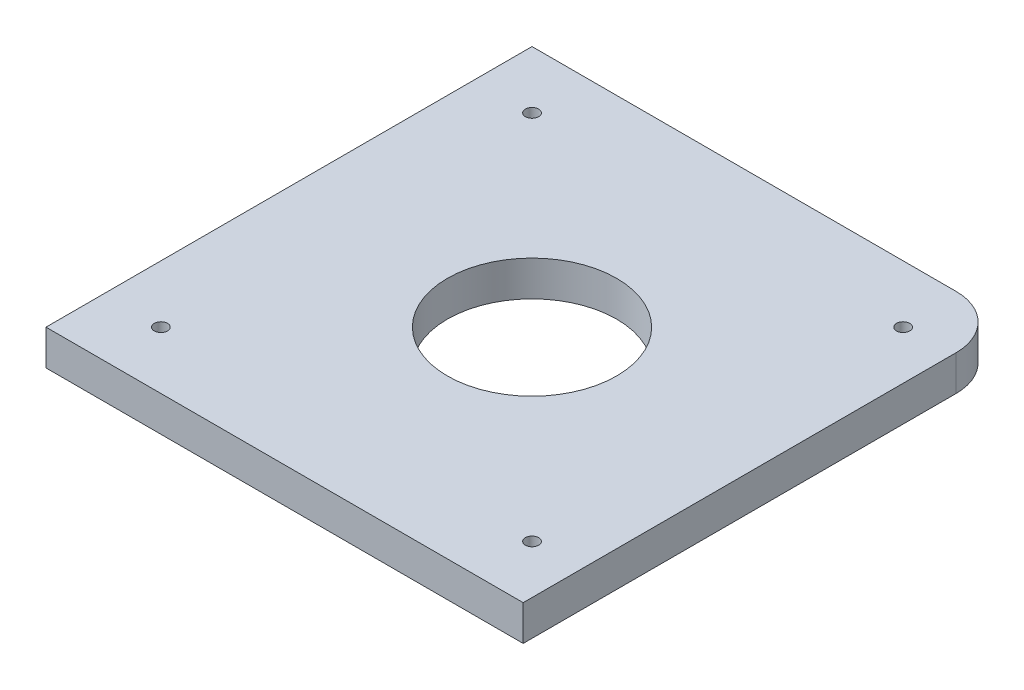
ISO-10303-21;
HEADER;
FILE_DESCRIPTION(('STEP AP214'),'2;1');
FILE_NAME('part.step','',(''),(''),'','','');
FILE_SCHEMA(('AUTOMOTIVE_DESIGN { 1 0 10303 214 1 1 1 1 }'));
ENDSEC;
DATA;
#1=APPLICATION_CONTEXT('core data for automotive mechanical design processes');
#2=APPLICATION_PROTOCOL_DEFINITION('international standard','automotive_design',2000,#1);
#3=PRODUCT_CONTEXT('',#1,'mechanical');
#4=PRODUCT('Part','Part','',(#3));
#5=PRODUCT_RELATED_PRODUCT_CATEGORY('part','',(#4));
#6=PRODUCT_DEFINITION_FORMATION('','',#4);
#7=PRODUCT_DEFINITION_CONTEXT('part definition',#1,'design');
#8=PRODUCT_DEFINITION('design','',#6,#7);
#9=PRODUCT_DEFINITION_SHAPE('','',#8);
#10=(LENGTH_UNIT() NAMED_UNIT(*) SI_UNIT(.MILLI.,.METRE.));
#11=(NAMED_UNIT(*) PLANE_ANGLE_UNIT() SI_UNIT($,.RADIAN.));
#12=(NAMED_UNIT(*) SI_UNIT($,.STERADIAN.) SOLID_ANGLE_UNIT());
#13=UNCERTAINTY_MEASURE_WITH_UNIT(LENGTH_MEASURE(1.E-05),#10,'distance_accuracy_value','');
#14=(GEOMETRIC_REPRESENTATION_CONTEXT(3) GLOBAL_UNCERTAINTY_ASSIGNED_CONTEXT((#13)) GLOBAL_UNIT_ASSIGNED_CONTEXT((#10,
#11,#12)) REPRESENTATION_CONTEXT('',''));
#15=CARTESIAN_POINT('',(0.,0.,0.));
#16=DIRECTION('',(0.,0.,1.));
#17=DIRECTION('',(1.,0.,0.));
#18=AXIS2_PLACEMENT_3D('',#15,#16,#17);
#19=CARTESIAN_POINT('',(0.,8.,0.));
#20=DIRECTION('',(0.,-1.,0.));
#21=DIRECTION('',(0.,0.,-1.));
#22=AXIS2_PLACEMENT_3D('',#19,#20,#21);
#23=PLANE('',#22);
#24=DIRECTION('',(0.,0.,-1.));
#25=VECTOR('',#24,1.);
#26=CARTESIAN_POINT('',(53.0000000000002,8.,-55.));
#27=LINE('',#26,#25);
#28=CARTESIAN_POINT('',(53.0000000000002,8.,54.9999999999998));
#29=VERTEX_POINT('',#28);
#30=CARTESIAN_POINT('',(53.0000000000002,8.,-43.));
#31=VERTEX_POINT('',#30);
#32=EDGE_CURVE('E116',#29,#31,#27,.T.);
#33=ORIENTED_EDGE('',*,*,#32,.T.);
#34=CARTESIAN_POINT('',(41.0000000000002,8.,-43.));
#35=DIRECTION('',(0.,-1.,0.));
#36=DIRECTION('',(0.,0.,-1.));
#37=AXIS2_PLACEMENT_3D('',#34,#35,#36);
#38=CIRCLE('',#37,12.);
#39=CARTESIAN_POINT('',(41.0000000000002,8.,-55.));
#40=VERTEX_POINT('',#39);
#41=EDGE_CURVE('E11',#31,#40,#38,.F.);
#42=ORIENTED_EDGE('',*,*,#41,.T.);
#43=DIRECTION('',(-1.,0.,0.));
#44=VECTOR('',#43,1.);
#45=CARTESIAN_POINT('',(-54.9999999999998,8.,-55.));
#46=LINE('',#45,#44);
#47=CARTESIAN_POINT('',(-54.9999999999998,8.,-55.));
#48=VERTEX_POINT('',#47);
#49=EDGE_CURVE('E83',#40,#48,#46,.T.);
#50=ORIENTED_EDGE('',*,*,#49,.T.);
#51=DIRECTION('',(0.,0.,1.));
#52=VECTOR('',#51,1.);
#53=CARTESIAN_POINT('',(-54.9999999999998,8.,54.9999999999998));
#54=LINE('',#53,#52);
#55=CARTESIAN_POINT('',(-54.9999999999998,8.,54.9999999999998));
#56=VERTEX_POINT('',#55);
#57=EDGE_CURVE('E86',#48,#56,#54,.T.);
#58=ORIENTED_EDGE('',*,*,#57,.T.);
#59=DIRECTION('',(1.,0.,0.));
#60=VECTOR('',#59,1.);
#61=CARTESIAN_POINT('',(53.0000000000002,8.,54.9999999999998));
#62=LINE('',#61,#60);
#63=EDGE_CURVE('E102',#56,#29,#62,.T.);
#64=ORIENTED_EDGE('',*,*,#63,.T.);
#65=EDGE_LOOP('',(#33,#42,#50,#58,#64));
#66=FACE_BOUND('',#65,.T.);
#67=CARTESIAN_POINT('',(0.,8.,0.));
#68=DIRECTION('',(0.,1.,0.));
#69=DIRECTION('',(0.,0.,1.));
#70=AXIS2_PLACEMENT_3D('',#67,#68,#69);
#71=CIRCLE('',#70,19.15);
#72=CARTESIAN_POINT('',(0.,8.,19.15));
#73=VERTEX_POINT('',#72);
#74=EDGE_CURVE('E123',#73,#73,#71,.T.);
#75=ORIENTED_EDGE('',*,*,#74,.F.);
#76=EDGE_LOOP('',(#75));
#77=FACE_BOUND('',#76,.T.);
#78=CARTESIAN_POINT('',(-41.9999999999998,8.,-42.));
#79=DIRECTION('',(0.,1.,0.));
#80=DIRECTION('',(0.,0.,1.));
#81=AXIS2_PLACEMENT_3D('',#78,#79,#80);
#82=CIRCLE('',#81,1.5);
#83=CARTESIAN_POINT('',(-41.9999999999998,8.,-40.5));
#84=VERTEX_POINT('',#83);
#85=EDGE_CURVE('E129',#84,#84,#82,.T.);
#86=ORIENTED_EDGE('',*,*,#85,.F.);
#87=EDGE_LOOP('',(#86));
#88=FACE_BOUND('',#87,.T.);
#89=CARTESIAN_POINT('',(42.,8.,-41.9999999999998));
#90=DIRECTION('',(0.,1.,0.));
#91=DIRECTION('',(0.,0.,1.));
#92=AXIS2_PLACEMENT_3D('',#89,#90,#91);
#93=CIRCLE('',#92,1.49999999999999);
#94=CARTESIAN_POINT('',(42.,8.,-40.4999999999998));
#95=VERTEX_POINT('',#94);
#96=EDGE_CURVE('E135',#95,#95,#93,.T.);
#97=ORIENTED_EDGE('',*,*,#96,.F.);
#98=EDGE_LOOP('',(#97));
#99=FACE_BOUND('',#98,.T.);
#100=CARTESIAN_POINT('',(41.9999999999998,8.,42.));
#101=DIRECTION('',(0.,1.,0.));
#102=DIRECTION('',(0.,0.,1.));
#103=AXIS2_PLACEMENT_3D('',#100,#101,#102);
#104=CIRCLE('',#103,1.5);
#105=CARTESIAN_POINT('',(41.9999999999998,8.,43.5));
#106=VERTEX_POINT('',#105);
#107=EDGE_CURVE('E141',#106,#106,#104,.T.);
#108=ORIENTED_EDGE('',*,*,#107,.F.);
#109=EDGE_LOOP('',(#108));
#110=FACE_BOUND('',#109,.T.);
#111=CARTESIAN_POINT('',(-42.,8.,41.9999999999998));
#112=DIRECTION('',(0.,1.,0.));
#113=DIRECTION('',(0.,0.,1.));
#114=AXIS2_PLACEMENT_3D('',#111,#112,#113);
#115=CIRCLE('',#114,1.5);
#116=CARTESIAN_POINT('',(-42.,8.,43.4999999999998));
#117=VERTEX_POINT('',#116);
#118=EDGE_CURVE('E147',#117,#117,#115,.T.);
#119=ORIENTED_EDGE('',*,*,#118,.F.);
#120=EDGE_LOOP('',(#119));
#121=FACE_BOUND('',#120,.T.);
#122=ADVANCED_FACE('F37',(#66,#77,#88,#99,#110,#121),#23,.F.);
#123=CARTESIAN_POINT('',(0.,0.,0.));
#124=DIRECTION('',(0.,-1.,0.));
#125=DIRECTION('',(0.,0.,-1.));
#126=AXIS2_PLACEMENT_3D('',#123,#124,#125);
#127=PLANE('',#126);
#128=CARTESIAN_POINT('',(41.9999999999998,0.,42.));
#129=DIRECTION('',(0.,1.,0.));
#130=DIRECTION('',(0.,0.,1.));
#131=AXIS2_PLACEMENT_3D('',#128,#129,#130);
#132=CIRCLE('',#131,1.5);
#133=CARTESIAN_POINT('',(41.9999999999998,0.,43.5));
#134=VERTEX_POINT('',#133);
#135=EDGE_CURVE('E144',#134,#134,#132,.T.);
#136=ORIENTED_EDGE('',*,*,#135,.T.);
#137=EDGE_LOOP('',(#136));
#138=FACE_BOUND('',#137,.T.);
#139=CARTESIAN_POINT('',(-41.9999999999998,0.,-42.));
#140=DIRECTION('',(0.,1.,0.));
#141=DIRECTION('',(0.,0.,1.));
#142=AXIS2_PLACEMENT_3D('',#139,#140,#141);
#143=CIRCLE('',#142,1.5);
#144=CARTESIAN_POINT('',(-41.9999999999998,0.,-40.5));
#145=VERTEX_POINT('',#144);
#146=EDGE_CURVE('E132',#145,#145,#143,.T.);
#147=ORIENTED_EDGE('',*,*,#146,.T.);
#148=EDGE_LOOP('',(#147));
#149=FACE_BOUND('',#148,.T.);
#150=DIRECTION('',(-1.,0.,0.));
#151=VECTOR('',#150,1.);
#152=CARTESIAN_POINT('',(-54.9999999999998,0.,-55.));
#153=LINE('',#152,#151);
#154=CARTESIAN_POINT('',(41.0000000000002,0.,-55.));
#155=VERTEX_POINT('',#154);
#156=CARTESIAN_POINT('',(-54.9999999999998,0.,-55.));
#157=VERTEX_POINT('',#156);
#158=EDGE_CURVE('E105',#155,#157,#153,.T.);
#159=ORIENTED_EDGE('',*,*,#158,.F.);
#160=CARTESIAN_POINT('',(41.0000000000002,0.,-43.));
#161=DIRECTION('',(0.,-1.,0.));
#162=DIRECTION('',(0.,0.,-1.));
#163=AXIS2_PLACEMENT_3D('',#160,#161,#162);
#164=CIRCLE('',#163,12.);
#165=CARTESIAN_POINT('',(53.0000000000002,0.,-43.));
#166=VERTEX_POINT('',#165);
#167=EDGE_CURVE('E59',#155,#166,#164,.T.);
#168=ORIENTED_EDGE('',*,*,#167,.T.);
#169=DIRECTION('',(0.,0.,-1.));
#170=VECTOR('',#169,1.);
#171=CARTESIAN_POINT('',(53.0000000000002,0.,-55.));
#172=LINE('',#171,#170);
#173=CARTESIAN_POINT('',(53.0000000000002,0.,54.9999999999998));
#174=VERTEX_POINT('',#173);
#175=EDGE_CURVE('E93',#174,#166,#172,.T.);
#176=ORIENTED_EDGE('',*,*,#175,.F.);
#177=DIRECTION('',(1.,0.,0.));
#178=VECTOR('',#177,1.);
#179=CARTESIAN_POINT('',(53.0000000000002,0.,54.9999999999998));
#180=LINE('',#179,#178);
#181=CARTESIAN_POINT('',(-54.9999999999998,0.,54.9999999999998));
#182=VERTEX_POINT('',#181);
#183=EDGE_CURVE('E118',#182,#174,#180,.T.);
#184=ORIENTED_EDGE('',*,*,#183,.F.);
#185=DIRECTION('',(0.,0.,1.));
#186=VECTOR('',#185,1.);
#187=CARTESIAN_POINT('',(-54.9999999999998,0.,54.9999999999998));
#188=LINE('',#187,#186);
#189=EDGE_CURVE('E120',#157,#182,#188,.T.);
#190=ORIENTED_EDGE('',*,*,#189,.F.);
#191=EDGE_LOOP('',(#159,#168,#176,#184,#190));
#192=FACE_BOUND('',#191,.T.);
#193=CARTESIAN_POINT('',(0.,0.,0.));
#194=DIRECTION('',(0.,1.,0.));
#195=DIRECTION('',(0.,0.,1.));
#196=AXIS2_PLACEMENT_3D('',#193,#194,#195);
#197=CIRCLE('',#196,19.15);
#198=CARTESIAN_POINT('',(0.,0.,19.15));
#199=VERTEX_POINT('',#198);
#200=EDGE_CURVE('E126',#199,#199,#197,.T.);
#201=ORIENTED_EDGE('',*,*,#200,.T.);
#202=EDGE_LOOP('',(#201));
#203=FACE_BOUND('',#202,.T.);
#204=CARTESIAN_POINT('',(42.,0.,-41.9999999999998));
#205=DIRECTION('',(0.,1.,0.));
#206=DIRECTION('',(0.,0.,1.));
#207=AXIS2_PLACEMENT_3D('',#204,#205,#206);
#208=CIRCLE('',#207,1.49999999999999);
#209=CARTESIAN_POINT('',(42.,0.,-40.4999999999998));
#210=VERTEX_POINT('',#209);
#211=EDGE_CURVE('E138',#210,#210,#208,.T.);
#212=ORIENTED_EDGE('',*,*,#211,.T.);
#213=EDGE_LOOP('',(#212));
#214=FACE_BOUND('',#213,.T.);
#215=CARTESIAN_POINT('',(-42.,0.,41.9999999999998));
#216=DIRECTION('',(0.,1.,0.));
#217=DIRECTION('',(0.,0.,1.));
#218=AXIS2_PLACEMENT_3D('',#215,#216,#217);
#219=CIRCLE('',#218,1.5);
#220=CARTESIAN_POINT('',(-42.,0.,43.4999999999998));
#221=VERTEX_POINT('',#220);
#222=EDGE_CURVE('E150',#221,#221,#219,.T.);
#223=ORIENTED_EDGE('',*,*,#222,.T.);
#224=EDGE_LOOP('',(#223));
#225=FACE_BOUND('',#224,.T.);
#226=ADVANCED_FACE('F160',(#138,#149,#192,#203,#214,#225),#127,.T.);
#227=CARTESIAN_POINT('',(-54.9999999999998,8.,-55.));
#228=DIRECTION('',(0.,0.,1.));
#229=DIRECTION('',(1.,0.,0.));
#230=AXIS2_PLACEMENT_3D('',#227,#228,#229);
#231=PLANE('',#230);
#232=ORIENTED_EDGE('',*,*,#49,.F.);
#233=DIRECTION('',(0.,-1.,0.));
#234=VECTOR('',#233,1.);
#235=CARTESIAN_POINT('',(41.0000000000002,8.,-55.));
#236=LINE('',#235,#234);
#237=EDGE_CURVE('E107',#40,#155,#236,.T.);
#238=ORIENTED_EDGE('',*,*,#237,.T.);
#239=ORIENTED_EDGE('',*,*,#158,.T.);
#240=DIRECTION('',(0.,-1.,0.));
#241=VECTOR('',#240,1.);
#242=CARTESIAN_POINT('',(-54.9999999999998,8.,-55.));
#243=LINE('',#242,#241);
#244=EDGE_CURVE('E98',#48,#157,#243,.T.);
#245=ORIENTED_EDGE('',*,*,#244,.F.);
#246=EDGE_LOOP('',(#232,#238,#239,#245));
#247=FACE_BOUND('',#246,.T.);
#248=ADVANCED_FACE('F104',(#247),#231,.F.);
#249=CARTESIAN_POINT('',(-54.9999999999998,8.,54.9999999999998));
#250=DIRECTION('',(1.,0.,0.));
#251=DIRECTION('',(0.,0.,-1.));
#252=AXIS2_PLACEMENT_3D('',#249,#250,#251);
#253=PLANE('',#252);
#254=ORIENTED_EDGE('',*,*,#189,.T.);
#255=DIRECTION('',(0.,-1.,0.));
#256=VECTOR('',#255,1.);
#257=CARTESIAN_POINT('',(-54.9999999999998,8.,54.9999999999998));
#258=LINE('',#257,#256);
#259=EDGE_CURVE('E100',#56,#182,#258,.T.);
#260=ORIENTED_EDGE('',*,*,#259,.F.);
#261=ORIENTED_EDGE('',*,*,#57,.F.);
#262=ORIENTED_EDGE('',*,*,#244,.T.);
#263=EDGE_LOOP('',(#254,#260,#261,#262));
#264=FACE_BOUND('',#263,.T.);
#265=ADVANCED_FACE('F97',(#264),#253,.F.);
#266=CARTESIAN_POINT('',(53.0000000000002,8.,54.9999999999998));
#267=DIRECTION('',(0.,0.,-1.));
#268=DIRECTION('',(-1.,0.,0.));
#269=AXIS2_PLACEMENT_3D('',#266,#267,#268);
#270=PLANE('',#269);
#271=ORIENTED_EDGE('',*,*,#183,.T.);
#272=DIRECTION('',(0.,-1.,0.));
#273=VECTOR('',#272,1.);
#274=CARTESIAN_POINT('',(53.0000000000002,8.,54.9999999999998));
#275=LINE('',#274,#273);
#276=EDGE_CURVE('E110',#29,#174,#275,.T.);
#277=ORIENTED_EDGE('',*,*,#276,.F.);
#278=ORIENTED_EDGE('',*,*,#63,.F.);
#279=ORIENTED_EDGE('',*,*,#259,.T.);
#280=EDGE_LOOP('',(#271,#277,#278,#279));
#281=FACE_BOUND('',#280,.T.);
#282=ADVANCED_FACE('F174',(#281),#270,.F.);
#283=CARTESIAN_POINT('',(53.0000000000002,8.,-55.));
#284=DIRECTION('',(-1.,0.,0.));
#285=DIRECTION('',(0.,0.,1.));
#286=AXIS2_PLACEMENT_3D('',#283,#284,#285);
#287=PLANE('',#286);
#288=ORIENTED_EDGE('',*,*,#175,.T.);
#289=DIRECTION('',(0.,-1.,0.));
#290=VECTOR('',#289,1.);
#291=CARTESIAN_POINT('',(53.0000000000002,8.,-43.));
#292=LINE('',#291,#290);
#293=EDGE_CURVE('E45',#166,#31,#292,.F.);
#294=ORIENTED_EDGE('',*,*,#293,.T.);
#295=ORIENTED_EDGE('',*,*,#32,.F.);
#296=ORIENTED_EDGE('',*,*,#276,.T.);
#297=EDGE_LOOP('',(#288,#294,#295,#296));
#298=FACE_BOUND('',#297,.T.);
#299=ADVANCED_FACE('F171',(#298),#287,.F.);
#300=CARTESIAN_POINT('',(0.,8.,0.));
#301=DIRECTION('',(0.,-1.,0.));
#302=DIRECTION('',(0.,0.,-1.));
#303=AXIS2_PLACEMENT_3D('',#300,#301,#302);
#304=CYLINDRICAL_SURFACE('',#303,19.15);
#305=ORIENTED_EDGE('',*,*,#74,.T.);
#306=EDGE_LOOP('',(#305));
#307=FACE_BOUND('',#306,.T.);
#308=ORIENTED_EDGE('',*,*,#200,.F.);
#309=EDGE_LOOP('',(#308));
#310=FACE_BOUND('',#309,.T.);
#311=ADVANCED_FACE('F168',(#307,#310),#304,.F.);
#312=CARTESIAN_POINT('',(-41.9999999999998,8.,-42.));
#313=DIRECTION('',(0.,-1.,0.));
#314=DIRECTION('',(0.,0.,-1.));
#315=AXIS2_PLACEMENT_3D('',#312,#313,#314);
#316=CYLINDRICAL_SURFACE('',#315,1.5);
#317=ORIENTED_EDGE('',*,*,#85,.T.);
#318=EDGE_LOOP('',(#317));
#319=FACE_BOUND('',#318,.T.);
#320=ORIENTED_EDGE('',*,*,#146,.F.);
#321=EDGE_LOOP('',(#320));
#322=FACE_BOUND('',#321,.T.);
#323=ADVANCED_FACE('F203',(#319,#322),#316,.F.);
#324=CARTESIAN_POINT('',(42.,8.,-41.9999999999998));
#325=DIRECTION('',(0.,-1.,0.));
#326=DIRECTION('',(0.,0.,-1.));
#327=AXIS2_PLACEMENT_3D('',#324,#325,#326);
#328=CYLINDRICAL_SURFACE('',#327,1.49999999999999);
#329=ORIENTED_EDGE('',*,*,#96,.T.);
#330=EDGE_LOOP('',(#329));
#331=FACE_BOUND('',#330,.T.);
#332=ORIENTED_EDGE('',*,*,#211,.F.);
#333=EDGE_LOOP('',(#332));
#334=FACE_BOUND('',#333,.T.);
#335=ADVANCED_FACE('F210',(#331,#334),#328,.F.);
#336=CARTESIAN_POINT('',(41.9999999999998,8.,42.));
#337=DIRECTION('',(0.,-1.,0.));
#338=DIRECTION('',(0.,0.,-1.));
#339=AXIS2_PLACEMENT_3D('',#336,#337,#338);
#340=CYLINDRICAL_SURFACE('',#339,1.5);
#341=ORIENTED_EDGE('',*,*,#107,.T.);
#342=EDGE_LOOP('',(#341));
#343=FACE_BOUND('',#342,.T.);
#344=ORIENTED_EDGE('',*,*,#135,.F.);
#345=EDGE_LOOP('',(#344));
#346=FACE_BOUND('',#345,.T.);
#347=ADVANCED_FACE('F217',(#343,#346),#340,.F.);
#348=CARTESIAN_POINT('',(-42.,8.,41.9999999999998));
#349=DIRECTION('',(0.,-1.,0.));
#350=DIRECTION('',(0.,0.,-1.));
#351=AXIS2_PLACEMENT_3D('',#348,#349,#350);
#352=CYLINDRICAL_SURFACE('',#351,1.5);
#353=ORIENTED_EDGE('',*,*,#118,.T.);
#354=EDGE_LOOP('',(#353));
#355=FACE_BOUND('',#354,.T.);
#356=ORIENTED_EDGE('',*,*,#222,.F.);
#357=EDGE_LOOP('',(#356));
#358=FACE_BOUND('',#357,.T.);
#359=ADVANCED_FACE('F156',(#355,#358),#352,.F.);
#360=CARTESIAN_POINT('',(41.0000000000002,8.,-43.));
#361=DIRECTION('',(0.,-1.,0.));
#362=DIRECTION('',(0.,0.,-1.));
#363=AXIS2_PLACEMENT_3D('',#360,#361,#362);
#364=CYLINDRICAL_SURFACE('',#363,12.);
#365=ORIENTED_EDGE('',*,*,#41,.F.);
#366=ORIENTED_EDGE('',*,*,#293,.F.);
#367=ORIENTED_EDGE('',*,*,#167,.F.);
#368=ORIENTED_EDGE('',*,*,#237,.F.);
#369=EDGE_LOOP('',(#365,#366,#367,#368));
#370=FACE_BOUND('',#369,.T.);
#371=ADVANCED_FACE('F39',(#370),#364,.T.);
#372=CLOSED_SHELL('',(#122,#226,#248,#265,#282,#299,#311,#323,#335,#347,#359,#371));
#373=MANIFOLD_SOLID_BREP('B2',#372);
#374=ADVANCED_BREP_SHAPE_REPRESENTATION('',(#18,#373),#14);
#375=SHAPE_DEFINITION_REPRESENTATION(#9,#374);
ENDSEC;
END-ISO-10303-21;
